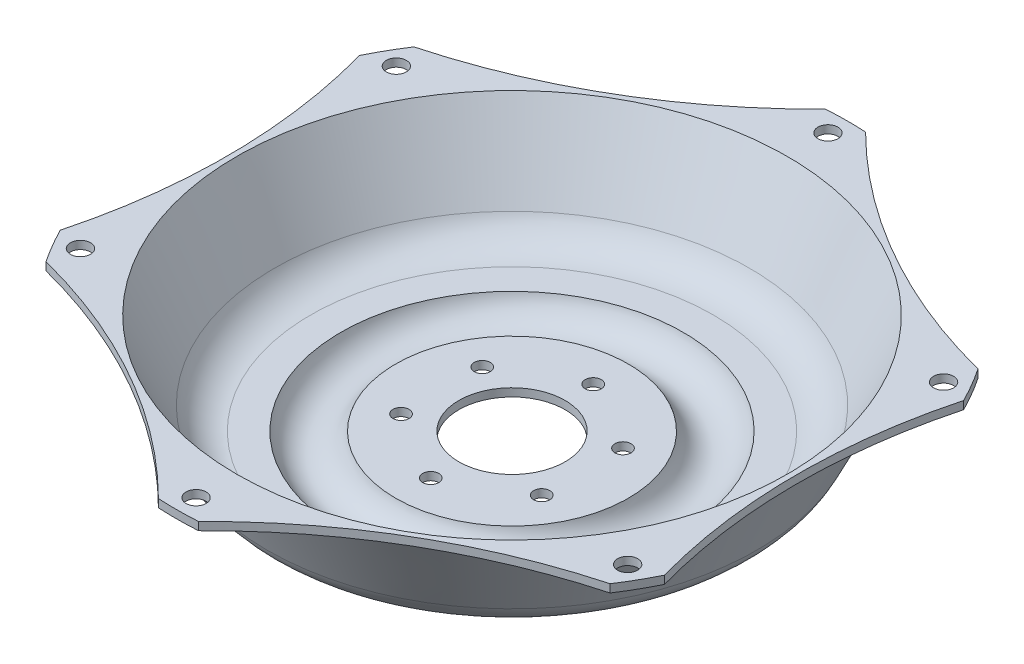
ISO-10303-21;
HEADER;
FILE_DESCRIPTION(('STEP AP214'),'2;1');
FILE_NAME('part.step','',(''),(''),'','','');
FILE_SCHEMA(('AUTOMOTIVE_DESIGN { 1 0 10303 214 1 1 1 1 }'));
ENDSEC;
DATA;
#1=APPLICATION_CONTEXT('core data for automotive mechanical design processes');
#2=APPLICATION_PROTOCOL_DEFINITION('international standard','automotive_design',2000,#1);
#3=PRODUCT_CONTEXT('',#1,'mechanical');
#4=PRODUCT('Part','Part','',(#3));
#5=PRODUCT_RELATED_PRODUCT_CATEGORY('part','',(#4));
#6=PRODUCT_DEFINITION_FORMATION('','',#4);
#7=PRODUCT_DEFINITION_CONTEXT('part definition',#1,'design');
#8=PRODUCT_DEFINITION('design','',#6,#7);
#9=PRODUCT_DEFINITION_SHAPE('','',#8);
#10=(LENGTH_UNIT() NAMED_UNIT(*) SI_UNIT(.MILLI.,.METRE.));
#11=(NAMED_UNIT(*) PLANE_ANGLE_UNIT() SI_UNIT($,.RADIAN.));
#12=(NAMED_UNIT(*) SI_UNIT($,.STERADIAN.) SOLID_ANGLE_UNIT());
#13=UNCERTAINTY_MEASURE_WITH_UNIT(LENGTH_MEASURE(1.E-05),#10,'distance_accuracy_value','');
#14=(GEOMETRIC_REPRESENTATION_CONTEXT(3) GLOBAL_UNCERTAINTY_ASSIGNED_CONTEXT((#13)) GLOBAL_UNIT_ASSIGNED_CONTEXT((#10,
#11,#12)) REPRESENTATION_CONTEXT('',''));
#15=CARTESIAN_POINT('',(0.,0.,0.));
#16=DIRECTION('',(0.,0.,1.));
#17=DIRECTION('',(1.,0.,0.));
#18=AXIS2_PLACEMENT_3D('',#15,#16,#17);
#19=CARTESIAN_POINT('',(0.,100.,0.));
#20=DIRECTION('',(0.,1.,0.));
#21=DIRECTION('',(0.,0.,1.));
#22=AXIS2_PLACEMENT_3D('',#19,#20,#21);
#23=CYLINDRICAL_SURFACE('',#22,335.);
#24=CARTESIAN_POINT('',(0.,100.,0.));
#25=DIRECTION('',(0.,1.,0.));
#26=DIRECTION('',(0.,0.,1.));
#27=AXIS2_PLACEMENT_3D('',#24,#25,#26);
#28=CIRCLE('',#27,335.);
#29=CARTESIAN_POINT('',(280.699413185461,100.,182.846491454821));
#30=VERTEX_POINT('',#29);
#31=CARTESIAN_POINT('',(300.373886854818,100.,148.32574994157));
#32=VERTEX_POINT('',#31);
#33=EDGE_CURVE('E219',#30,#32,#28,.T.);
#34=ORIENTED_EDGE('',*,*,#33,.F.);
#35=DIRECTION('',(0.,-1.,0.));
#36=VECTOR('',#35,1.);
#37=CARTESIAN_POINT('',(280.699413185461,102.,182.846491454821));
#38=LINE('',#37,#36);
#39=CARTESIAN_POINT('',(280.699413185461,92.,182.846491454821));
#40=VERTEX_POINT('',#39);
#41=EDGE_CURVE('E172',#30,#40,#38,.T.);
#42=ORIENTED_EDGE('',*,*,#41,.T.);
#43=CARTESIAN_POINT('',(0.,92.,0.));
#44=DIRECTION('',(0.,1.,0.));
#45=DIRECTION('',(0.,0.,1.));
#46=AXIS2_PLACEMENT_3D('',#43,#44,#45);
#47=CIRCLE('',#46,335.);
#48=CARTESIAN_POINT('',(300.373886854818,92.,148.32574994157));
#49=VERTEX_POINT('',#48);
#50=EDGE_CURVE('E178',#40,#49,#47,.T.);
#51=ORIENTED_EDGE('',*,*,#50,.T.);
#52=DIRECTION('',(0.,-1.,0.));
#53=VECTOR('',#52,1.);
#54=CARTESIAN_POINT('',(300.373886854818,102.,148.32574994157));
#55=LINE('',#54,#53);
#56=EDGE_CURVE('E322',#32,#49,#55,.T.);
#57=ORIENTED_EDGE('',*,*,#56,.F.);
#58=EDGE_LOOP('',(#34,#42,#51,#57));
#59=FACE_BOUND('',#58,.T.);
#60=ADVANCED_FACE('F44',(#59),#23,.T.);
#61=CARTESIAN_POINT('',(-18.0000000000001,92.,334.516068373404));
#62=VERTEX_POINT('',#61);
#63=CARTESIAN_POINT('',(21.7330759426298,92.,334.29429162053));
#64=VERTEX_POINT('',#63);
#65=EDGE_CURVE('E169',#62,#64,#47,.T.);
#66=ORIENTED_EDGE('',*,*,#65,.T.);
#67=DIRECTION('',(0.,-1.,0.));
#68=VECTOR('',#67,1.);
#69=CARTESIAN_POINT('',(21.7330759426298,102.,334.29429162053));
#70=LINE('',#69,#68);
#71=CARTESIAN_POINT('',(21.7330759426298,100.,334.29429162053));
#72=VERTEX_POINT('',#71);
#73=EDGE_CURVE('E149',#72,#64,#70,.T.);
#74=ORIENTED_EDGE('',*,*,#73,.F.);
#75=CARTESIAN_POINT('',(-18.0000000000001,100.,334.516068373404));
#76=VERTEX_POINT('',#75);
#77=EDGE_CURVE('E216',#76,#72,#28,.T.);
#78=ORIENTED_EDGE('',*,*,#77,.F.);
#79=DIRECTION('',(0.,-1.,0.));
#80=VECTOR('',#79,1.);
#81=CARTESIAN_POINT('',(-18.0000000000001,102.,334.516068373404));
#82=LINE('',#81,#80);
#83=EDGE_CURVE('E176',#76,#62,#82,.T.);
#84=ORIENTED_EDGE('',*,*,#83,.T.);
#85=EDGE_LOOP('',(#66,#74,#78,#84));
#86=FACE_BOUND('',#85,.T.);
#87=ADVANCED_FACE('F175',(#86),#23,.T.);
#88=CARTESIAN_POINT('',(298.69941318546,100.,-151.669576918584));
#89=VERTEX_POINT('',#88);
#90=CARTESIAN_POINT('',(278.640810912188,100.,-185.968541678958));
#91=VERTEX_POINT('',#90);
#92=EDGE_CURVE('E312',#89,#91,#28,.T.);
#93=ORIENTED_EDGE('',*,*,#92,.F.);
#94=DIRECTION('',(0.,-1.,0.));
#95=VECTOR('',#94,1.);
#96=CARTESIAN_POINT('',(298.69941318546,102.,-151.669576918584));
#97=LINE('',#96,#95);
#98=CARTESIAN_POINT('',(298.69941318546,92.,-151.669576918584));
#99=VERTEX_POINT('',#98);
#100=EDGE_CURVE('E335',#89,#99,#97,.T.);
#101=ORIENTED_EDGE('',*,*,#100,.T.);
#102=CARTESIAN_POINT('',(278.640810912188,92.,-185.968541678958));
#103=VERTEX_POINT('',#102);
#104=EDGE_CURVE('E184',#99,#103,#47,.T.);
#105=ORIENTED_EDGE('',*,*,#104,.T.);
#106=DIRECTION('',(0.,-1.,0.));
#107=VECTOR('',#106,1.);
#108=CARTESIAN_POINT('',(278.640810912188,102.,-185.968541678958));
#109=LINE('',#108,#107);
#110=EDGE_CURVE('E339',#91,#103,#109,.T.);
#111=ORIENTED_EDGE('',*,*,#110,.F.);
#112=EDGE_LOOP('',(#93,#101,#105,#111));
#113=FACE_BOUND('',#112,.T.);
#114=ADVANCED_FACE('F292',(#113),#23,.T.);
#115=CARTESIAN_POINT('',(18.0000000000001,100.,-334.516068373404));
#116=VERTEX_POINT('',#115);
#117=CARTESIAN_POINT('',(-21.7330759426321,100.,-334.29429162053));
#118=VERTEX_POINT('',#117);
#119=EDGE_CURVE('E308',#116,#118,#28,.T.);
#120=ORIENTED_EDGE('',*,*,#119,.F.);
#121=DIRECTION('',(0.,-1.,0.));
#122=VECTOR('',#121,1.);
#123=CARTESIAN_POINT('',(18.0000000000001,102.,-334.516068373404));
#124=LINE('',#123,#122);
#125=CARTESIAN_POINT('',(18.0000000000001,92.,-334.516068373404));
#126=VERTEX_POINT('',#125);
#127=EDGE_CURVE('E330',#116,#126,#124,.T.);
#128=ORIENTED_EDGE('',*,*,#127,.T.);
#129=CARTESIAN_POINT('',(-21.7330759426321,92.,-334.29429162053));
#130=VERTEX_POINT('',#129);
#131=EDGE_CURVE('E193',#126,#130,#47,.T.);
#132=ORIENTED_EDGE('',*,*,#131,.T.);
#133=DIRECTION('',(0.,-1.,0.));
#134=VECTOR('',#133,1.);
#135=CARTESIAN_POINT('',(-21.7330759426321,102.,-334.29429162053));
#136=LINE('',#135,#134);
#137=EDGE_CURVE('E347',#118,#130,#136,.T.);
#138=ORIENTED_EDGE('',*,*,#137,.F.);
#139=EDGE_LOOP('',(#120,#128,#132,#138));
#140=FACE_BOUND('',#139,.T.);
#141=ADVANCED_FACE('F301',(#140),#23,.T.);
#142=CARTESIAN_POINT('',(-280.699413185462,100.,-182.846491454819));
#143=VERTEX_POINT('',#142);
#144=CARTESIAN_POINT('',(-300.373886854819,100.,-148.325749941568));
#145=VERTEX_POINT('',#144);
#146=EDGE_CURVE('E306',#143,#145,#28,.T.);
#147=ORIENTED_EDGE('',*,*,#146,.F.);
#148=DIRECTION('',(0.,-1.,0.));
#149=VECTOR('',#148,1.);
#150=CARTESIAN_POINT('',(-280.699413185462,102.,-182.846491454819));
#151=LINE('',#150,#149);
#152=CARTESIAN_POINT('',(-280.699413185462,92.,-182.846491454819));
#153=VERTEX_POINT('',#152);
#154=EDGE_CURVE('E352',#143,#153,#151,.T.);
#155=ORIENTED_EDGE('',*,*,#154,.T.);
#156=CARTESIAN_POINT('',(-300.373886854819,92.,-148.325749941568));
#157=VERTEX_POINT('',#156);
#158=EDGE_CURVE('E186',#153,#157,#47,.T.);
#159=ORIENTED_EDGE('',*,*,#158,.T.);
#160=DIRECTION('',(0.,-1.,0.));
#161=VECTOR('',#160,1.);
#162=CARTESIAN_POINT('',(-300.373886854819,102.,-148.325749941568));
#163=LINE('',#162,#161);
#164=EDGE_CURVE('E356',#145,#157,#163,.T.);
#165=ORIENTED_EDGE('',*,*,#164,.F.);
#166=EDGE_LOOP('',(#147,#155,#159,#165));
#167=FACE_BOUND('',#166,.T.);
#168=ADVANCED_FACE('F295',(#167),#23,.T.);
#169=CARTESIAN_POINT('',(-298.699413185459,100.,151.669576918586));
#170=VERTEX_POINT('',#169);
#171=CARTESIAN_POINT('',(-278.640810912188,100.,185.968541678958));
#172=VERTEX_POINT('',#171);
#173=EDGE_CURVE('E220',#170,#172,#28,.T.);
#174=ORIENTED_EDGE('',*,*,#173,.F.);
#175=DIRECTION('',(0.,-1.,0.));
#176=VECTOR('',#175,1.);
#177=CARTESIAN_POINT('',(-298.699413185459,102.,151.669576918586));
#178=LINE('',#177,#176);
#179=CARTESIAN_POINT('',(-298.699413185459,92.,151.669576918586));
#180=VERTEX_POINT('',#179);
#181=EDGE_CURVE('E304',#170,#180,#178,.T.);
#182=ORIENTED_EDGE('',*,*,#181,.T.);
#183=CARTESIAN_POINT('',(-278.640810912188,92.,185.968541678958));
#184=VERTEX_POINT('',#183);
#185=EDGE_CURVE('E179',#180,#184,#47,.T.);
#186=ORIENTED_EDGE('',*,*,#185,.T.);
#187=DIRECTION('',(0.,-1.,0.));
#188=VECTOR('',#187,1.);
#189=CARTESIAN_POINT('',(-278.640810912188,102.,185.968541678958));
#190=LINE('',#189,#188);
#191=EDGE_CURVE('E212',#172,#184,#190,.T.);
#192=ORIENTED_EDGE('',*,*,#191,.F.);
#193=EDGE_LOOP('',(#174,#182,#186,#192));
#194=FACE_BOUND('',#193,.T.);
#195=ADVANCED_FACE('F288',(#194),#23,.T.);
#196=CARTESIAN_POINT('',(274.476350399319,92.,0.));
#197=DIRECTION('',(0.,1.,0.));
#198=DIRECTION('',(0.,0.,1.));
#199=AXIS2_PLACEMENT_3D('',#196,#197,#198);
#200=PLANE('',#199);
#201=CARTESIAN_POINT('',(429.181794485482,92.,733.874227341707));
#202=DIRECTION('',(0.,1.,0.));
#203=DIRECTION('',(0.86602540378444,0.,0.499999999999998));
#204=AXIS2_PLACEMENT_3D('',#201,#202,#203);
#205=CIRCLE('',#204,570.682559110713);
#206=CARTESIAN_POINT('',(141.086400584634,92.,241.248987137485));
#207=VERTEX_POINT('',#206);
#208=EDGE_CURVE('E152',#64,#207,#205,.F.);
#209=ORIENTED_EDGE('',*,*,#208,.F.);
#210=ORIENTED_EDGE('',*,*,#65,.F.);
#211=CARTESIAN_POINT('',(-420.962826817856,92.,738.619450537072));
#212=DIRECTION('',(0.,-1.,0.));
#213=DIRECTION('',(0.,0.,-1.));
#214=AXIS2_PLACEMENT_3D('',#211,#212,#213);
#215=CIRCLE('',#214,570.682559110713);
#216=CARTESIAN_POINT('',(-138.384551206011,92.,242.808900603543));
#217=VERTEX_POINT('',#216);
#218=EDGE_CURVE('E363',#62,#217,#215,.F.);
#219=ORIENTED_EDGE('',*,*,#218,.T.);
#220=CARTESIAN_POINT('',(0.,92.,0.));
#221=DIRECTION('',(0.,1.,0.));
#222=DIRECTION('',(0.,0.,1.));
#223=AXIS2_PLACEMENT_3D('',#220,#221,#222);
#224=CIRCLE('',#223,279.475305214593);
#225=EDGE_CURVE('E171',#217,#207,#224,.T.);
#226=ORIENTED_EDGE('',*,*,#225,.T.);
#227=EDGE_LOOP('',(#209,#210,#219,#226));
#228=FACE_BOUND('',#227,.T.);
#229=CARTESIAN_POINT('',(0.,92.,315.));
#230=DIRECTION('',(0.,-1.,0.));
#231=DIRECTION('',(0.,0.,-1.));
#232=AXIS2_PLACEMENT_3D('',#229,#230,#231);
#233=CIRCLE('',#232,10.);
#234=CARTESIAN_POINT('',(0.,92.,305.));
#235=VERTEX_POINT('',#234);
#236=EDGE_CURVE('E365',#235,#235,#233,.T.);
#237=ORIENTED_EDGE('',*,*,#236,.F.);
#238=EDGE_LOOP('',(#237));
#239=FACE_BOUND('',#238,.T.);
#240=ADVANCED_FACE('F166',(#228,#239),#200,.F.);
#241=CARTESIAN_POINT('',(272.798002192099,92.,157.499999999999));
#242=DIRECTION('',(0.,-1.,0.));
#243=DIRECTION('',(-0.86602540378444,0.,-0.499999999999998));
#244=AXIS2_PLACEMENT_3D('',#241,#242,#243);
#245=CIRCLE('',#244,10.);
#246=CARTESIAN_POINT('',(264.137748154254,92.,152.499999999999));
#247=VERTEX_POINT('',#246);
#248=EDGE_CURVE('E359',#247,#247,#245,.T.);
#249=ORIENTED_EDGE('',*,*,#248,.F.);
#250=EDGE_LOOP('',(#249));
#251=FACE_BOUND('',#250,.T.);
#252=EDGE_CURVE('E160',#207,#40,#205,.F.);
#253=ORIENTED_EDGE('',*,*,#252,.F.);
#254=CARTESIAN_POINT('',(279.470951790644,92.,-1.55991346605877));
#255=VERTEX_POINT('',#254);
#256=EDGE_CURVE('E194',#207,#255,#224,.T.);
#257=ORIENTED_EDGE('',*,*,#256,.T.);
#258=CARTESIAN_POINT('',(850.144621303336,92.,-4.74522319536791));
#259=DIRECTION('',(0.,1.,0.));
#260=DIRECTION('',(0.866025403784436,0.,-0.500000000000004));
#261=AXIS2_PLACEMENT_3D('',#258,#259,#260);
#262=CIRCLE('',#261,570.682559110713);
#263=EDGE_CURVE('E328',#49,#255,#262,.F.);
#264=ORIENTED_EDGE('',*,*,#263,.F.);
#265=ORIENTED_EDGE('',*,*,#50,.F.);
#266=EDGE_LOOP('',(#253,#257,#264,#265));
#267=FACE_BOUND('',#266,.T.);
#268=ADVANCED_FACE('F300',(#251,#267),#200,.F.);
#269=CARTESIAN_POINT('',(272.798002192097,92.,-157.500000000001));
#270=DIRECTION('',(0.,-1.,0.));
#271=DIRECTION('',(-0.866025403784436,0.,0.500000000000004));
#272=AXIS2_PLACEMENT_3D('',#269,#270,#271);
#273=CIRCLE('',#272,10.);
#274=CARTESIAN_POINT('',(264.137748154253,92.,-152.500000000001));
#275=VERTEX_POINT('',#274);
#276=EDGE_CURVE('E376',#275,#275,#273,.T.);
#277=ORIENTED_EDGE('',*,*,#276,.F.);
#278=EDGE_LOOP('',(#277));
#279=FACE_BOUND('',#278,.T.);
#280=EDGE_CURVE('E325',#255,#99,#262,.F.);
#281=ORIENTED_EDGE('',*,*,#280,.F.);
#282=CARTESIAN_POINT('',(138.384551206011,92.,-242.808900603543));
#283=VERTEX_POINT('',#282);
#284=EDGE_CURVE('E198',#255,#283,#224,.T.);
#285=ORIENTED_EDGE('',*,*,#284,.T.);
#286=CARTESIAN_POINT('',(420.962826817856,92.,-738.619450537072));
#287=DIRECTION('',(0.,1.,0.));
#288=DIRECTION('',(0.,0.,-1.));
#289=AXIS2_PLACEMENT_3D('',#286,#287,#288);
#290=CIRCLE('',#289,570.682559110713);
#291=EDGE_CURVE('E343',#103,#283,#290,.F.);
#292=ORIENTED_EDGE('',*,*,#291,.F.);
#293=ORIENTED_EDGE('',*,*,#104,.F.);
#294=EDGE_LOOP('',(#281,#285,#292,#293));
#295=FACE_BOUND('',#294,.T.);
#296=ADVANCED_FACE('F486',(#279,#295),#200,.F.);
#297=CARTESIAN_POINT('',(0.,92.,-315.));
#298=DIRECTION('',(0.,-1.,0.));
#299=DIRECTION('',(0.,0.,1.));
#300=AXIS2_PLACEMENT_3D('',#297,#298,#299);
#301=CIRCLE('',#300,10.);
#302=CARTESIAN_POINT('',(0.,92.,-305.));
#303=VERTEX_POINT('',#302);
#304=EDGE_CURVE('E391',#303,#303,#301,.T.);
#305=ORIENTED_EDGE('',*,*,#304,.F.);
#306=EDGE_LOOP('',(#305));
#307=FACE_BOUND('',#306,.T.);
#308=EDGE_CURVE('E341',#283,#126,#290,.F.);
#309=ORIENTED_EDGE('',*,*,#308,.F.);
#310=CARTESIAN_POINT('',(-141.086400584635,92.,-241.248987137484));
#311=VERTEX_POINT('',#310);
#312=EDGE_CURVE('E205',#283,#311,#224,.T.);
#313=ORIENTED_EDGE('',*,*,#312,.T.);
#314=CARTESIAN_POINT('',(-429.181794485487,92.,-733.874227341704));
#315=DIRECTION('',(0.,1.,0.));
#316=DIRECTION('',(-0.866025403784443,0.,-0.499999999999992));
#317=AXIS2_PLACEMENT_3D('',#314,#315,#316);
#318=CIRCLE('',#317,570.682559110713);
#319=EDGE_CURVE('E66',#130,#311,#318,.F.);
#320=ORIENTED_EDGE('',*,*,#319,.F.);
#321=ORIENTED_EDGE('',*,*,#131,.F.);
#322=EDGE_LOOP('',(#309,#313,#320,#321));
#323=FACE_BOUND('',#322,.T.);
#324=ADVANCED_FACE('F497',(#307,#323),#200,.F.);
#325=CARTESIAN_POINT('',(-272.7980021921,92.,-157.499999999997));
#326=DIRECTION('',(0.,-1.,0.));
#327=DIRECTION('',(0.866025403784443,0.,0.499999999999992));
#328=AXIS2_PLACEMENT_3D('',#325,#326,#327);
#329=CIRCLE('',#328,10.);
#330=CARTESIAN_POINT('',(-264.137748154255,92.,-152.499999999998));
#331=VERTEX_POINT('',#330);
#332=EDGE_CURVE('E385',#331,#331,#329,.T.);
#333=ORIENTED_EDGE('',*,*,#332,.F.);
#334=EDGE_LOOP('',(#333));
#335=FACE_BOUND('',#334,.T.);
#336=EDGE_CURVE('E349',#311,#153,#318,.F.);
#337=ORIENTED_EDGE('',*,*,#336,.F.);
#338=CARTESIAN_POINT('',(-279.470951790644,92.,1.55991346606071));
#339=VERTEX_POINT('',#338);
#340=EDGE_CURVE('E199',#311,#339,#224,.T.);
#341=ORIENTED_EDGE('',*,*,#340,.T.);
#342=CARTESIAN_POINT('',(-850.144621303336,92.,4.74522319537379));
#343=DIRECTION('',(0.,1.,0.));
#344=DIRECTION('',(-0.866025403784433,0.,0.50000000000001));
#345=AXIS2_PLACEMENT_3D('',#342,#343,#344);
#346=CIRCLE('',#345,570.682559110713);
#347=EDGE_CURVE('E58',#157,#339,#346,.F.);
#348=ORIENTED_EDGE('',*,*,#347,.F.);
#349=ORIENTED_EDGE('',*,*,#158,.F.);
#350=EDGE_LOOP('',(#337,#341,#348,#349));
#351=FACE_BOUND('',#350,.T.);
#352=ADVANCED_FACE('F285',(#335,#351),#200,.F.);
#353=CARTESIAN_POINT('',(274.476350399319,100.,0.));
#354=DIRECTION('',(0.,1.,0.));
#355=DIRECTION('',(0.,0.,1.));
#356=AXIS2_PLACEMENT_3D('',#353,#354,#355);
#357=PLANE('',#356);
#358=CARTESIAN_POINT('',(-272.798002192096,100.,157.500000000003));
#359=DIRECTION('',(0.,1.,0.));
#360=DIRECTION('',(-0.866025403784433,0.,0.50000000000001));
#361=AXIS2_PLACEMENT_3D('',#358,#359,#360);
#362=CIRCLE('',#361,10.);
#363=CARTESIAN_POINT('',(-281.458256229941,100.,162.500000000003));
#364=VERTEX_POINT('',#363);
#365=EDGE_CURVE('E381',#364,#364,#362,.T.);
#366=ORIENTED_EDGE('',*,*,#365,.F.);
#367=EDGE_LOOP('',(#366));
#368=FACE_BOUND('',#367,.T.);
#369=CARTESIAN_POINT('',(-272.7980021921,100.,-157.499999999997));
#370=DIRECTION('',(0.,1.,0.));
#371=DIRECTION('',(-0.866025403784443,0.,-0.499999999999992));
#372=AXIS2_PLACEMENT_3D('',#369,#370,#371);
#373=CIRCLE('',#372,10.);
#374=CARTESIAN_POINT('',(-281.458256229944,100.,-162.499999999997));
#375=VERTEX_POINT('',#374);
#376=EDGE_CURVE('E380',#375,#375,#373,.T.);
#377=ORIENTED_EDGE('',*,*,#376,.F.);
#378=EDGE_LOOP('',(#377));
#379=FACE_BOUND('',#378,.T.);
#380=CARTESIAN_POINT('',(0.,100.,-315.));
#381=DIRECTION('',(0.,1.,0.));
#382=DIRECTION('',(0.,0.,-1.));
#383=AXIS2_PLACEMENT_3D('',#380,#381,#382);
#384=CIRCLE('',#383,10.);
#385=CARTESIAN_POINT('',(0.,100.,-325.));
#386=VERTEX_POINT('',#385);
#387=EDGE_CURVE('E388',#386,#386,#384,.T.);
#388=ORIENTED_EDGE('',*,*,#387,.F.);
#389=EDGE_LOOP('',(#388));
#390=FACE_BOUND('',#389,.T.);
#391=CARTESIAN_POINT('',(272.798002192097,100.,-157.500000000001));
#392=DIRECTION('',(0.,1.,0.));
#393=DIRECTION('',(0.866025403784436,0.,-0.500000000000004));
#394=AXIS2_PLACEMENT_3D('',#391,#392,#393);
#395=CIRCLE('',#394,10.);
#396=CARTESIAN_POINT('',(281.458256229942,100.,-162.500000000001));
#397=VERTEX_POINT('',#396);
#398=EDGE_CURVE('E394',#397,#397,#395,.T.);
#399=ORIENTED_EDGE('',*,*,#398,.F.);
#400=EDGE_LOOP('',(#399));
#401=FACE_BOUND('',#400,.T.);
#402=CARTESIAN_POINT('',(272.798002192099,100.,157.499999999999));
#403=DIRECTION('',(0.,1.,0.));
#404=DIRECTION('',(0.86602540378444,0.,0.499999999999998));
#405=AXIS2_PLACEMENT_3D('',#402,#403,#404);
#406=CIRCLE('',#405,10.);
#407=CARTESIAN_POINT('',(281.458256229943,100.,162.499999999999));
#408=VERTEX_POINT('',#407);
#409=EDGE_CURVE('E373',#408,#408,#406,.T.);
#410=ORIENTED_EDGE('',*,*,#409,.F.);
#411=EDGE_LOOP('',(#410));
#412=FACE_BOUND('',#411,.T.);
#413=CARTESIAN_POINT('',(0.,100.,315.));
#414=DIRECTION('',(0.,1.,0.));
#415=DIRECTION('',(0.,0.,1.));
#416=AXIS2_PLACEMENT_3D('',#413,#414,#415);
#417=CIRCLE('',#416,10.);
#418=CARTESIAN_POINT('',(0.,100.,325.));
#419=VERTEX_POINT('',#418);
#420=EDGE_CURVE('E207',#419,#419,#417,.T.);
#421=ORIENTED_EDGE('',*,*,#420,.F.);
#422=EDGE_LOOP('',(#421));
#423=FACE_BOUND('',#422,.T.);
#424=CARTESIAN_POINT('',(0.,100.,0.));
#425=DIRECTION('',(0.,1.,0.));
#426=DIRECTION('',(0.,0.,1.));
#427=AXIS2_PLACEMENT_3D('',#424,#425,#426);
#428=CIRCLE('',#427,274.476350399319);
#429=CARTESIAN_POINT('',(0.,100.,274.476350399319));
#430=VERTEX_POINT('',#429);
#431=EDGE_CURVE('E221',#430,#430,#428,.T.);
#432=ORIENTED_EDGE('',*,*,#431,.F.);
#433=EDGE_LOOP('',(#432));
#434=FACE_BOUND('',#433,.T.);
#435=ORIENTED_EDGE('',*,*,#77,.T.);
#436=CARTESIAN_POINT('',(429.181794485482,100.,733.874227341707));
#437=DIRECTION('',(0.,1.,0.));
#438=DIRECTION('',(0.86602540378444,0.,0.499999999999998));
#439=AXIS2_PLACEMENT_3D('',#436,#437,#438);
#440=CIRCLE('',#439,570.682559110713);
#441=EDGE_CURVE('E155',#72,#30,#440,.F.);
#442=ORIENTED_EDGE('',*,*,#441,.T.);
#443=ORIENTED_EDGE('',*,*,#33,.T.);
#444=CARTESIAN_POINT('',(850.144621303336,100.,-4.74522319536791));
#445=DIRECTION('',(0.,1.,0.));
#446=DIRECTION('',(0.866025403784436,0.,-0.500000000000004));
#447=AXIS2_PLACEMENT_3D('',#444,#445,#446);
#448=CIRCLE('',#447,570.682559110713);
#449=EDGE_CURVE('E161',#32,#89,#448,.F.);
#450=ORIENTED_EDGE('',*,*,#449,.T.);
#451=ORIENTED_EDGE('',*,*,#92,.T.);
#452=CARTESIAN_POINT('',(420.962826817856,100.,-738.619450537072));
#453=DIRECTION('',(0.,1.,0.));
#454=DIRECTION('',(0.,0.,-1.));
#455=AXIS2_PLACEMENT_3D('',#452,#453,#454);
#456=CIRCLE('',#455,570.682559110713);
#457=EDGE_CURVE('E326',#91,#116,#456,.F.);
#458=ORIENTED_EDGE('',*,*,#457,.T.);
#459=ORIENTED_EDGE('',*,*,#119,.T.);
#460=CARTESIAN_POINT('',(-429.181794485487,100.,-733.874227341704));
#461=DIRECTION('',(0.,1.,0.));
#462=DIRECTION('',(-0.866025403784443,0.,-0.499999999999992));
#463=AXIS2_PLACEMENT_3D('',#460,#461,#462);
#464=CIRCLE('',#463,570.682559110713);
#465=EDGE_CURVE('E342',#118,#143,#464,.F.);
#466=ORIENTED_EDGE('',*,*,#465,.T.);
#467=ORIENTED_EDGE('',*,*,#146,.T.);
#468=CARTESIAN_POINT('',(-850.144621303336,100.,4.74522319537379));
#469=DIRECTION('',(0.,1.,0.));
#470=DIRECTION('',(-0.866025403784433,0.,0.50000000000001));
#471=AXIS2_PLACEMENT_3D('',#468,#469,#470);
#472=CIRCLE('',#471,570.682559110713);
#473=EDGE_CURVE('E350',#145,#170,#472,.F.);
#474=ORIENTED_EDGE('',*,*,#473,.T.);
#475=ORIENTED_EDGE('',*,*,#173,.T.);
#476=CARTESIAN_POINT('',(-420.962826817856,100.,738.619450537072));
#477=DIRECTION('',(0.,1.,0.));
#478=DIRECTION('',(0.,0.,1.));
#479=AXIS2_PLACEMENT_3D('',#476,#477,#478);
#480=CIRCLE('',#479,570.682559110713);
#481=EDGE_CURVE('E200',#172,#76,#480,.F.);
#482=ORIENTED_EDGE('',*,*,#481,.T.);
#483=EDGE_LOOP('',(#435,#442,#443,#450,#451,#458,#459,#466,#467,#474,#475,#482));
#484=FACE_BOUND('',#483,.T.);
#485=ADVANCED_FACE('F282',(#368,#379,#390,#401,#412,#423,#434,#484),#357,.T.);
#486=CARTESIAN_POINT('',(-272.798002192096,92.,157.500000000003));
#487=DIRECTION('',(0.,-1.,0.));
#488=DIRECTION('',(0.866025403784433,0.,-0.50000000000001));
#489=AXIS2_PLACEMENT_3D('',#486,#487,#488);
#490=CIRCLE('',#489,10.);
#491=CARTESIAN_POINT('',(-264.137748154252,92.,152.500000000003));
#492=VERTEX_POINT('',#491);
#493=EDGE_CURVE('E377',#492,#492,#490,.T.);
#494=ORIENTED_EDGE('',*,*,#493,.F.);
#495=EDGE_LOOP('',(#494));
#496=FACE_BOUND('',#495,.T.);
#497=EDGE_CURVE('E358',#339,#180,#346,.F.);
#498=ORIENTED_EDGE('',*,*,#497,.F.);
#499=EDGE_CURVE('E196',#339,#217,#224,.T.);
#500=ORIENTED_EDGE('',*,*,#499,.T.);
#501=CARTESIAN_POINT('',(-420.962826817856,92.,738.619450537072));
#502=DIRECTION('',(0.,1.,0.));
#503=DIRECTION('',(0.,0.,1.));
#504=AXIS2_PLACEMENT_3D('',#501,#502,#503);
#505=CIRCLE('',#504,570.682559110713);
#506=EDGE_CURVE('E12',#184,#217,#505,.F.);
#507=ORIENTED_EDGE('',*,*,#506,.F.);
#508=ORIENTED_EDGE('',*,*,#185,.F.);
#509=EDGE_LOOP('',(#498,#500,#507,#508));
#510=FACE_BOUND('',#509,.T.);
#511=ADVANCED_FACE('F273',(#496,#510),#200,.F.);
#512=CARTESIAN_POINT('',(0.,0.,0.));
#513=DIRECTION('',(0.,1.,0.));
#514=DIRECTION('',(0.,0.,1.));
#515=AXIS2_PLACEMENT_3D('',#512,#513,#514);
#516=CYLINDRICAL_SURFACE('',#515,53.);
#517=CARTESIAN_POINT('',(0.,0.,0.));
#518=DIRECTION('',(0.,1.,0.));
#519=DIRECTION('',(0.,0.,1.));
#520=AXIS2_PLACEMENT_3D('',#517,#518,#519);
#521=CIRCLE('',#520,53.);
#522=CARTESIAN_POINT('',(0.,0.,53.));
#523=VERTEX_POINT('',#522);
#524=EDGE_CURVE('E51',#523,#523,#521,.T.);
#525=ORIENTED_EDGE('',*,*,#524,.T.);
#526=EDGE_LOOP('',(#525));
#527=FACE_BOUND('',#526,.T.);
#528=CARTESIAN_POINT('',(0.,-8.,0.));
#529=DIRECTION('',(0.,1.,0.));
#530=DIRECTION('',(0.,0.,1.));
#531=AXIS2_PLACEMENT_3D('',#528,#529,#530);
#532=CIRCLE('',#531,53.);
#533=CARTESIAN_POINT('',(0.,-8.,53.));
#534=VERTEX_POINT('',#533);
#535=EDGE_CURVE('E224',#534,#534,#532,.T.);
#536=ORIENTED_EDGE('',*,*,#535,.F.);
#537=EDGE_LOOP('',(#536));
#538=FACE_BOUND('',#537,.T.);
#539=ADVANCED_FACE('F270',(#527,#538),#516,.F.);
#540=CARTESIAN_POINT('',(53.,0.,0.));
#541=DIRECTION('',(0.,1.,0.));
#542=DIRECTION('',(0.,0.,1.));
#543=AXIS2_PLACEMENT_3D('',#540,#541,#542);
#544=PLANE('',#543);
#545=CARTESIAN_POINT('',(-70.1480577065391,0.,40.5000000000008));
#546=DIRECTION('',(0.,1.,0.));
#547=DIRECTION('',(-0.866025403784433,0.,0.50000000000001));
#548=AXIS2_PLACEMENT_3D('',#545,#546,#547);
#549=CIRCLE('',#548,8.);
#550=CARTESIAN_POINT('',(-77.0762609368145,0.,44.5000000000009));
#551=VERTEX_POINT('',#550);
#552=EDGE_CURVE('E417',#551,#551,#549,.T.);
#553=ORIENTED_EDGE('',*,*,#552,.F.);
#554=EDGE_LOOP('',(#553));
#555=FACE_BOUND('',#554,.T.);
#556=CARTESIAN_POINT('',(-70.1480577065399,0.,-40.4999999999993));
#557=DIRECTION('',(0.,1.,0.));
#558=DIRECTION('',(-0.866025403784443,0.,-0.499999999999992));
#559=AXIS2_PLACEMENT_3D('',#556,#557,#558);
#560=CIRCLE('',#559,8.);
#561=CARTESIAN_POINT('',(-77.0762609368155,0.,-44.4999999999993));
#562=VERTEX_POINT('',#561);
#563=EDGE_CURVE('E416',#562,#562,#560,.T.);
#564=ORIENTED_EDGE('',*,*,#563,.F.);
#565=EDGE_LOOP('',(#564));
#566=FACE_BOUND('',#565,.T.);
#567=CARTESIAN_POINT('',(0.,0.,-81.));
#568=DIRECTION('',(0.,1.,0.));
#569=DIRECTION('',(0.,0.,-1.));
#570=AXIS2_PLACEMENT_3D('',#567,#568,#569);
#571=CIRCLE('',#570,8.);
#572=CARTESIAN_POINT('',(0.,0.,-89.));
#573=VERTEX_POINT('',#572);
#574=EDGE_CURVE('E423',#573,#573,#571,.T.);
#575=ORIENTED_EDGE('',*,*,#574,.F.);
#576=EDGE_LOOP('',(#575));
#577=FACE_BOUND('',#576,.T.);
#578=CARTESIAN_POINT('',(70.1480577065393,0.,-40.5000000000003));
#579=DIRECTION('',(0.,1.,0.));
#580=DIRECTION('',(0.866025403784436,0.,-0.500000000000004));
#581=AXIS2_PLACEMENT_3D('',#578,#579,#580);
#582=CIRCLE('',#581,8.);
#583=CARTESIAN_POINT('',(77.0762609368149,0.,-44.5000000000004));
#584=VERTEX_POINT('',#583);
#585=EDGE_CURVE('E429',#584,#584,#582,.T.);
#586=ORIENTED_EDGE('',*,*,#585,.F.);
#587=EDGE_LOOP('',(#586));
#588=FACE_BOUND('',#587,.T.);
#589=CARTESIAN_POINT('',(70.1480577065396,0.,40.4999999999998));
#590=DIRECTION('',(0.,1.,0.));
#591=DIRECTION('',(0.86602540378444,0.,0.499999999999998));
#592=AXIS2_PLACEMENT_3D('',#589,#590,#591);
#593=CIRCLE('',#592,8.);
#594=CARTESIAN_POINT('',(77.0762609368152,0.,44.4999999999998));
#595=VERTEX_POINT('',#594);
#596=EDGE_CURVE('E409',#595,#595,#593,.T.);
#597=ORIENTED_EDGE('',*,*,#596,.F.);
#598=EDGE_LOOP('',(#597));
#599=FACE_BOUND('',#598,.T.);
#600=CARTESIAN_POINT('',(0.,0.,81.));
#601=DIRECTION('',(0.,1.,0.));
#602=DIRECTION('',(0.,0.,1.));
#603=AXIS2_PLACEMENT_3D('',#600,#601,#602);
#604=CIRCLE('',#603,8.);
#605=CARTESIAN_POINT('',(0.,0.,89.));
#606=VERTEX_POINT('',#605);
#607=EDGE_CURVE('E384',#606,#606,#604,.T.);
#608=ORIENTED_EDGE('',*,*,#607,.F.);
#609=EDGE_LOOP('',(#608));
#610=FACE_BOUND('',#609,.T.);
#611=CARTESIAN_POINT('',(0.,0.,0.));
#612=DIRECTION('',(0.,1.,0.));
#613=DIRECTION('',(0.,0.,1.));
#614=AXIS2_PLACEMENT_3D('',#611,#612,#613);
#615=CIRCLE('',#614,116.);
#616=CARTESIAN_POINT('',(0.,0.,116.));
#617=VERTEX_POINT('',#616);
#618=EDGE_CURVE('E233',#617,#617,#615,.T.);
#619=ORIENTED_EDGE('',*,*,#618,.T.);
#620=EDGE_LOOP('',(#619));
#621=FACE_BOUND('',#620,.T.);
#622=ORIENTED_EDGE('',*,*,#524,.F.);
#623=EDGE_LOOP('',(#622));
#624=FACE_BOUND('',#623,.T.);
#625=ADVANCED_FACE('F272',(#555,#566,#577,#588,#599,#610,#621,#624),#544,.T.);
#626=CARTESIAN_POINT('',(0.,8.,0.));
#627=DIRECTION('',(0.,1.,0.));
#628=DIRECTION('',(0.,0.,1.));
#629=AXIS2_PLACEMENT_3D('',#626,#627,#628);
#630=TOROIDAL_SURFACE('',#629,143.35415873318,28.5);
#631=CARTESIAN_POINT('',(0.,0.,0.));
#632=DIRECTION('',(0.,1.,0.));
#633=DIRECTION('',(0.,0.,1.));
#634=AXIS2_PLACEMENT_3D('',#631,#632,#633);
#635=CIRCLE('',#634,170.70831746636);
#636=CARTESIAN_POINT('',(0.,0.,170.70831746636));
#637=VERTEX_POINT('',#636);
#638=EDGE_CURVE('E230',#637,#637,#635,.T.);
#639=ORIENTED_EDGE('',*,*,#638,.T.);
#640=EDGE_LOOP('',(#639));
#641=FACE_BOUND('',#640,.T.);
#642=ORIENTED_EDGE('',*,*,#618,.F.);
#643=EDGE_LOOP('',(#642));
#644=FACE_BOUND('',#643,.T.);
#645=ADVANCED_FACE('F279',(#641,#644),#630,.F.);
#646=CARTESIAN_POINT('',(170.70831746636,0.,0.));
#647=DIRECTION('',(0.,1.,0.));
#648=DIRECTION('',(0.,0.,1.));
#649=AXIS2_PLACEMENT_3D('',#646,#647,#648);
#650=PLANE('',#649);
#651=CARTESIAN_POINT('',(0.,0.,0.));
#652=DIRECTION('',(0.,1.,0.));
#653=DIRECTION('',(0.,0.,1.));
#654=AXIS2_PLACEMENT_3D('',#651,#652,#653);
#655=CIRCLE('',#654,200.70831746636);
#656=CARTESIAN_POINT('',(0.,0.,200.70831746636));
#657=VERTEX_POINT('',#656);
#658=EDGE_CURVE('E227',#657,#657,#655,.T.);
#659=ORIENTED_EDGE('',*,*,#658,.T.);
#660=EDGE_LOOP('',(#659));
#661=FACE_BOUND('',#660,.T.);
#662=ORIENTED_EDGE('',*,*,#638,.F.);
#663=EDGE_LOOP('',(#662));
#664=FACE_BOUND('',#663,.T.);
#665=ADVANCED_FACE('F450',(#661,#664),#650,.T.);
#666=CARTESIAN_POINT('',(0.,40.,0.));
#667=DIRECTION('',(0.,1.,0.));
#668=DIRECTION('',(0.,0.,1.));
#669=AXIS2_PLACEMENT_3D('',#666,#667,#668);
#670=TOROIDAL_SURFACE('',#669,200.70831746636,40.);
#671=CARTESIAN_POINT('',(0.,22.465154128437,0.));
#672=DIRECTION('',(0.,1.,0.));
#673=DIRECTION('',(0.,0.,1.));
#674=AXIS2_PLACEMENT_3D('',#671,#672,#673);
#675=CIRCLE('',#674,236.660079318326);
#676=CARTESIAN_POINT('',(0.,22.465154128437,236.660079318326));
#677=VERTEX_POINT('',#676);
#678=EDGE_CURVE('E218',#677,#677,#675,.T.);
#679=ORIENTED_EDGE('',*,*,#678,.T.);
#680=EDGE_LOOP('',(#679));
#681=FACE_BOUND('',#680,.T.);
#682=ORIENTED_EDGE('',*,*,#658,.F.);
#683=EDGE_LOOP('',(#682));
#684=FACE_BOUND('',#683,.T.);
#685=ADVANCED_FACE('F456',(#681,#684),#670,.F.);
#686=CARTESIAN_POINT('',(0.,22.465154128437,0.));
#687=DIRECTION('',(0.,1.,0.));
#688=DIRECTION('',(0.,0.,1.));
#689=AXIS2_PLACEMENT_3D('',#686,#687,#688);
#690=CONICAL_SURFACE('',#689,236.660079318326,0.453785605518523);
#691=ORIENTED_EDGE('',*,*,#431,.T.);
#692=EDGE_LOOP('',(#691));
#693=FACE_BOUND('',#692,.T.);
#694=ORIENTED_EDGE('',*,*,#678,.F.);
#695=EDGE_LOOP('',(#694));
#696=FACE_BOUND('',#695,.T.);
#697=ADVANCED_FACE('F264',(#693,#696),#690,.F.);
#698=CARTESIAN_POINT('',(53.,-8.,0.));
#699=DIRECTION('',(0.,1.,0.));
#700=DIRECTION('',(0.,0.,1.));
#701=AXIS2_PLACEMENT_3D('',#698,#699,#700);
#702=PLANE('',#701);
#703=CARTESIAN_POINT('',(-70.1480577065391,-8.,40.5000000000008));
#704=DIRECTION('',(0.,-1.,0.));
#705=DIRECTION('',(0.866025403784433,0.,-0.50000000000001));
#706=AXIS2_PLACEMENT_3D('',#703,#704,#705);
#707=CIRCLE('',#706,8.);
#708=CARTESIAN_POINT('',(-63.2198544762636,-8.,36.5000000000007));
#709=VERTEX_POINT('',#708);
#710=EDGE_CURVE('E413',#709,#709,#707,.T.);
#711=ORIENTED_EDGE('',*,*,#710,.F.);
#712=EDGE_LOOP('',(#711));
#713=FACE_BOUND('',#712,.T.);
#714=CARTESIAN_POINT('',(-70.1480577065399,-8.,-40.4999999999993));
#715=DIRECTION('',(0.,-1.,0.));
#716=DIRECTION('',(0.866025403784443,0.,0.499999999999992));
#717=AXIS2_PLACEMENT_3D('',#714,#715,#716);
#718=CIRCLE('',#717,8.);
#719=CARTESIAN_POINT('',(-63.2198544762644,-8.,-36.4999999999994));
#720=VERTEX_POINT('',#719);
#721=EDGE_CURVE('E420',#720,#720,#718,.T.);
#722=ORIENTED_EDGE('',*,*,#721,.F.);
#723=EDGE_LOOP('',(#722));
#724=FACE_BOUND('',#723,.T.);
#725=CARTESIAN_POINT('',(0.,-8.,-81.));
#726=DIRECTION('',(0.,-1.,0.));
#727=DIRECTION('',(0.,0.,1.));
#728=AXIS2_PLACEMENT_3D('',#725,#726,#727);
#729=CIRCLE('',#728,8.);
#730=CARTESIAN_POINT('',(0.,-8.,-73.));
#731=VERTEX_POINT('',#730);
#732=EDGE_CURVE('E426',#731,#731,#729,.T.);
#733=ORIENTED_EDGE('',*,*,#732,.F.);
#734=EDGE_LOOP('',(#733));
#735=FACE_BOUND('',#734,.T.);
#736=CARTESIAN_POINT('',(70.1480577065393,-8.,-40.5000000000003));
#737=DIRECTION('',(0.,-1.,0.));
#738=DIRECTION('',(-0.866025403784436,0.,0.500000000000004));
#739=AXIS2_PLACEMENT_3D('',#736,#737,#738);
#740=CIRCLE('',#739,8.);
#741=CARTESIAN_POINT('',(63.2198544762639,-8.,-36.5000000000003));
#742=VERTEX_POINT('',#741);
#743=EDGE_CURVE('E412',#742,#742,#740,.T.);
#744=ORIENTED_EDGE('',*,*,#743,.F.);
#745=EDGE_LOOP('',(#744));
#746=FACE_BOUND('',#745,.T.);
#747=CARTESIAN_POINT('',(70.1480577065396,-8.,40.4999999999998));
#748=DIRECTION('',(0.,-1.,0.));
#749=DIRECTION('',(-0.86602540378444,0.,-0.499999999999998));
#750=AXIS2_PLACEMENT_3D('',#747,#748,#749);
#751=CIRCLE('',#750,8.);
#752=CARTESIAN_POINT('',(63.2198544762641,-8.,36.4999999999999));
#753=VERTEX_POINT('',#752);
#754=EDGE_CURVE('E406',#753,#753,#751,.T.);
#755=ORIENTED_EDGE('',*,*,#754,.F.);
#756=EDGE_LOOP('',(#755));
#757=FACE_BOUND('',#756,.T.);
#758=CARTESIAN_POINT('',(0.,-8.,81.));
#759=DIRECTION('',(0.,-1.,0.));
#760=DIRECTION('',(0.,0.,-1.));
#761=AXIS2_PLACEMENT_3D('',#758,#759,#760);
#762=CIRCLE('',#761,8.);
#763=CARTESIAN_POINT('',(0.,-8.,73.));
#764=VERTEX_POINT('',#763);
#765=EDGE_CURVE('E403',#764,#764,#762,.T.);
#766=ORIENTED_EDGE('',*,*,#765,.F.);
#767=EDGE_LOOP('',(#766));
#768=FACE_BOUND('',#767,.T.);
#769=CARTESIAN_POINT('',(0.,-8.,0.));
#770=DIRECTION('',(0.,-1.,0.));
#771=DIRECTION('',(0.,0.,-1.));
#772=AXIS2_PLACEMENT_3D('',#769,#770,#771);
#773=CIRCLE('',#772,110.547909328531);
#774=CARTESIAN_POINT('',(0.,-8.,-110.547909328531));
#775=VERTEX_POINT('',#774);
#776=EDGE_CURVE('E238',#775,#775,#773,.F.);
#777=ORIENTED_EDGE('',*,*,#776,.F.);
#778=EDGE_LOOP('',(#777));
#779=FACE_BOUND('',#778,.T.);
#780=ORIENTED_EDGE('',*,*,#535,.T.);
#781=EDGE_LOOP('',(#780));
#782=FACE_BOUND('',#781,.T.);
#783=ADVANCED_FACE('F258',(#713,#724,#735,#746,#757,#768,#779,#782),#702,.F.);
#784=CARTESIAN_POINT('',(0.,8.,0.));
#785=DIRECTION('',(0.,1.,0.));
#786=DIRECTION('',(0.,0.,1.));
#787=AXIS2_PLACEMENT_3D('',#784,#785,#786);
#788=TOROIDAL_SURFACE('',#787,143.35415873318,36.5);
#789=CARTESIAN_POINT('',(0.,-8.,0.));
#790=DIRECTION('',(0.,1.,0.));
#791=DIRECTION('',(0.,0.,1.));
#792=AXIS2_PLACEMENT_3D('',#789,#790,#791);
#793=CIRCLE('',#792,176.160408137828);
#794=CARTESIAN_POINT('',(0.,-8.,176.160408137828));
#795=VERTEX_POINT('',#794);
#796=EDGE_CURVE('E241',#795,#795,#793,.T.);
#797=ORIENTED_EDGE('',*,*,#796,.F.);
#798=EDGE_LOOP('',(#797));
#799=FACE_BOUND('',#798,.T.);
#800=ORIENTED_EDGE('',*,*,#776,.T.);
#801=EDGE_LOOP('',(#800));
#802=FACE_BOUND('',#801,.T.);
#803=ADVANCED_FACE('F252',(#799,#802),#788,.T.);
#804=CARTESIAN_POINT('',(170.70831746636,-8.,0.));
#805=DIRECTION('',(0.,1.,0.));
#806=DIRECTION('',(0.,0.,1.));
#807=AXIS2_PLACEMENT_3D('',#804,#805,#806);
#808=PLANE('',#807);
#809=CARTESIAN_POINT('',(0.,-8.00000000000001,0.));
#810=DIRECTION('',(0.,1.,0.));
#811=DIRECTION('',(0.,0.,1.));
#812=AXIS2_PLACEMENT_3D('',#809,#810,#811);
#813=CIRCLE('',#812,200.70831746636);
#814=CARTESIAN_POINT('',(0.,-8.00000000000001,200.70831746636));
#815=VERTEX_POINT('',#814);
#816=EDGE_CURVE('E181',#815,#815,#813,.T.);
#817=ORIENTED_EDGE('',*,*,#816,.F.);
#818=EDGE_LOOP('',(#817));
#819=FACE_BOUND('',#818,.T.);
#820=ORIENTED_EDGE('',*,*,#796,.T.);
#821=EDGE_LOOP('',(#820));
#822=FACE_BOUND('',#821,.T.);
#823=ADVANCED_FACE('F249',(#819,#822),#808,.F.);
#824=CARTESIAN_POINT('',(0.,40.,0.));
#825=DIRECTION('',(0.,1.,0.));
#826=DIRECTION('',(0.,0.,1.));
#827=AXIS2_PLACEMENT_3D('',#824,#825,#826);
#828=TOROIDAL_SURFACE('',#827,200.70831746636,48.);
#829=CARTESIAN_POINT('',(0.,18.9581849541244,0.));
#830=DIRECTION('',(0.,1.,0.));
#831=DIRECTION('',(0.,0.,1.));
#832=AXIS2_PLACEMENT_3D('',#829,#830,#831);
#833=CIRCLE('',#832,243.85043168872);
#834=CARTESIAN_POINT('',(0.,18.9581849541244,243.85043168872));
#835=VERTEX_POINT('',#834);
#836=EDGE_CURVE('E177',#835,#835,#833,.T.);
#837=ORIENTED_EDGE('',*,*,#836,.F.);
#838=EDGE_LOOP('',(#837));
#839=FACE_BOUND('',#838,.T.);
#840=ORIENTED_EDGE('',*,*,#816,.T.);
#841=EDGE_LOOP('',(#840));
#842=FACE_BOUND('',#841,.T.);
#843=ADVANCED_FACE('F247',(#839,#842),#828,.T.);
#844=CARTESIAN_POINT('',(0.,18.9581849541244,0.));
#845=DIRECTION('',(0.,1.,0.));
#846=DIRECTION('',(0.,0.,1.));
#847=AXIS2_PLACEMENT_3D('',#844,#845,#846);
#848=CONICAL_SURFACE('',#847,243.85043168872,0.453785605518523);
#849=ORIENTED_EDGE('',*,*,#225,.F.);
#850=ORIENTED_EDGE('',*,*,#499,.F.);
#851=ORIENTED_EDGE('',*,*,#340,.F.);
#852=ORIENTED_EDGE('',*,*,#312,.F.);
#853=ORIENTED_EDGE('',*,*,#284,.F.);
#854=ORIENTED_EDGE('',*,*,#256,.F.);
#855=EDGE_LOOP('',(#849,#850,#851,#852,#853,#854));
#856=FACE_BOUND('',#855,.T.);
#857=ORIENTED_EDGE('',*,*,#836,.T.);
#858=EDGE_LOOP('',(#857));
#859=FACE_BOUND('',#858,.T.);
#860=ADVANCED_FACE('F463',(#856,#859),#848,.T.);
#861=CARTESIAN_POINT('',(0.,102.,315.));
#862=DIRECTION('',(0.,-1.,0.));
#863=DIRECTION('',(0.,0.,-1.));
#864=AXIS2_PLACEMENT_3D('',#861,#862,#863);
#865=CYLINDRICAL_SURFACE('',#864,10.);
#866=ORIENTED_EDGE('',*,*,#420,.T.);
#867=EDGE_LOOP('',(#866));
#868=FACE_BOUND('',#867,.T.);
#869=ORIENTED_EDGE('',*,*,#236,.T.);
#870=EDGE_LOOP('',(#869));
#871=FACE_BOUND('',#870,.T.);
#872=ADVANCED_FACE('F466',(#868,#871),#865,.F.);
#873=CARTESIAN_POINT('',(-420.962826817856,102.,738.619450537072));
#874=DIRECTION('',(0.,-1.,0.));
#875=DIRECTION('',(0.,0.,-1.));
#876=AXIS2_PLACEMENT_3D('',#873,#874,#875);
#877=CYLINDRICAL_SURFACE('',#876,570.682559110713);
#878=ORIENTED_EDGE('',*,*,#191,.T.);
#879=ORIENTED_EDGE('',*,*,#506,.T.);
#880=ORIENTED_EDGE('',*,*,#218,.F.);
#881=ORIENTED_EDGE('',*,*,#83,.F.);
#882=ORIENTED_EDGE('',*,*,#481,.F.);
#883=EDGE_LOOP('',(#878,#879,#880,#881,#882));
#884=FACE_BOUND('',#883,.T.);
#885=ADVANCED_FACE('F471',(#884),#877,.F.);
#886=CARTESIAN_POINT('',(-850.144621303336,102.,4.74522319537379));
#887=DIRECTION('',(0.,-1.,0.));
#888=DIRECTION('',(0.866025403784433,0.,-0.50000000000001));
#889=AXIS2_PLACEMENT_3D('',#886,#887,#888);
#890=CYLINDRICAL_SURFACE('',#889,570.682559110713);
#891=ORIENTED_EDGE('',*,*,#164,.T.);
#892=ORIENTED_EDGE('',*,*,#347,.T.);
#893=ORIENTED_EDGE('',*,*,#497,.T.);
#894=ORIENTED_EDGE('',*,*,#181,.F.);
#895=ORIENTED_EDGE('',*,*,#473,.F.);
#896=EDGE_LOOP('',(#891,#892,#893,#894,#895));
#897=FACE_BOUND('',#896,.T.);
#898=ADVANCED_FACE('F503',(#897),#890,.F.);
#899=CARTESIAN_POINT('',(-429.181794485487,102.,-733.874227341704));
#900=DIRECTION('',(0.,-1.,0.));
#901=DIRECTION('',(0.866025403784443,0.,0.499999999999992));
#902=AXIS2_PLACEMENT_3D('',#899,#900,#901);
#903=CYLINDRICAL_SURFACE('',#902,570.682559110713);
#904=ORIENTED_EDGE('',*,*,#137,.T.);
#905=ORIENTED_EDGE('',*,*,#319,.T.);
#906=ORIENTED_EDGE('',*,*,#336,.T.);
#907=ORIENTED_EDGE('',*,*,#154,.F.);
#908=ORIENTED_EDGE('',*,*,#465,.F.);
#909=EDGE_LOOP('',(#904,#905,#906,#907,#908));
#910=FACE_BOUND('',#909,.T.);
#911=ADVANCED_FACE('F501',(#910),#903,.F.);
#912=CARTESIAN_POINT('',(420.962826817856,102.,-738.619450537072));
#913=DIRECTION('',(0.,-1.,0.));
#914=DIRECTION('',(0.,0.,1.));
#915=AXIS2_PLACEMENT_3D('',#912,#913,#914);
#916=CYLINDRICAL_SURFACE('',#915,570.682559110713);
#917=ORIENTED_EDGE('',*,*,#110,.T.);
#918=ORIENTED_EDGE('',*,*,#291,.T.);
#919=ORIENTED_EDGE('',*,*,#308,.T.);
#920=ORIENTED_EDGE('',*,*,#127,.F.);
#921=ORIENTED_EDGE('',*,*,#457,.F.);
#922=EDGE_LOOP('',(#917,#918,#919,#920,#921));
#923=FACE_BOUND('',#922,.T.);
#924=ADVANCED_FACE('F666',(#923),#916,.F.);
#925=CARTESIAN_POINT('',(850.144621303336,102.,-4.74522319536791));
#926=DIRECTION('',(0.,-1.,0.));
#927=DIRECTION('',(-0.866025403784436,0.,0.500000000000004));
#928=AXIS2_PLACEMENT_3D('',#925,#926,#927);
#929=CYLINDRICAL_SURFACE('',#928,570.682559110713);
#930=ORIENTED_EDGE('',*,*,#56,.T.);
#931=ORIENTED_EDGE('',*,*,#263,.T.);
#932=ORIENTED_EDGE('',*,*,#280,.T.);
#933=ORIENTED_EDGE('',*,*,#100,.F.);
#934=ORIENTED_EDGE('',*,*,#449,.F.);
#935=EDGE_LOOP('',(#930,#931,#932,#933,#934));
#936=FACE_BOUND('',#935,.T.);
#937=ADVANCED_FACE('F483',(#936),#929,.F.);
#938=CARTESIAN_POINT('',(429.181794485482,102.,733.874227341707));
#939=DIRECTION('',(0.,-1.,0.));
#940=DIRECTION('',(-0.86602540378444,0.,-0.499999999999998));
#941=AXIS2_PLACEMENT_3D('',#938,#939,#940);
#942=CYLINDRICAL_SURFACE('',#941,570.682559110713);
#943=ORIENTED_EDGE('',*,*,#73,.T.);
#944=ORIENTED_EDGE('',*,*,#208,.T.);
#945=ORIENTED_EDGE('',*,*,#252,.T.);
#946=ORIENTED_EDGE('',*,*,#41,.F.);
#947=ORIENTED_EDGE('',*,*,#441,.F.);
#948=EDGE_LOOP('',(#943,#944,#945,#946,#947));
#949=FACE_BOUND('',#948,.T.);
#950=ADVANCED_FACE('F151',(#949),#942,.F.);
#951=CARTESIAN_POINT('',(-272.798002192096,102.,157.500000000003));
#952=DIRECTION('',(0.,-1.,0.));
#953=DIRECTION('',(0.866025403784433,0.,-0.50000000000001));
#954=AXIS2_PLACEMENT_3D('',#951,#952,#953);
#955=CYLINDRICAL_SURFACE('',#954,10.);
#956=ORIENTED_EDGE('',*,*,#365,.T.);
#957=EDGE_LOOP('',(#956));
#958=FACE_BOUND('',#957,.T.);
#959=ORIENTED_EDGE('',*,*,#493,.T.);
#960=EDGE_LOOP('',(#959));
#961=FACE_BOUND('',#960,.T.);
#962=ADVANCED_FACE('F691',(#958,#961),#955,.F.);
#963=CARTESIAN_POINT('',(272.798002192099,102.,157.499999999999));
#964=DIRECTION('',(0.,-1.,0.));
#965=DIRECTION('',(-0.86602540378444,0.,-0.499999999999998));
#966=AXIS2_PLACEMENT_3D('',#963,#964,#965);
#967=CYLINDRICAL_SURFACE('',#966,10.);
#968=ORIENTED_EDGE('',*,*,#409,.T.);
#969=EDGE_LOOP('',(#968));
#970=FACE_BOUND('',#969,.T.);
#971=ORIENTED_EDGE('',*,*,#248,.T.);
#972=EDGE_LOOP('',(#971));
#973=FACE_BOUND('',#972,.T.);
#974=ADVANCED_FACE('F700',(#970,#973),#967,.F.);
#975=CARTESIAN_POINT('',(272.798002192097,102.,-157.500000000001));
#976=DIRECTION('',(0.,-1.,0.));
#977=DIRECTION('',(-0.866025403784436,0.,0.500000000000004));
#978=AXIS2_PLACEMENT_3D('',#975,#976,#977);
#979=CYLINDRICAL_SURFACE('',#978,10.);
#980=ORIENTED_EDGE('',*,*,#398,.T.);
#981=EDGE_LOOP('',(#980));
#982=FACE_BOUND('',#981,.T.);
#983=ORIENTED_EDGE('',*,*,#276,.T.);
#984=EDGE_LOOP('',(#983));
#985=FACE_BOUND('',#984,.T.);
#986=ADVANCED_FACE('F710',(#982,#985),#979,.F.);
#987=CARTESIAN_POINT('',(0.,102.,-315.));
#988=DIRECTION('',(0.,-1.,0.));
#989=DIRECTION('',(0.,0.,1.));
#990=AXIS2_PLACEMENT_3D('',#987,#988,#989);
#991=CYLINDRICAL_SURFACE('',#990,10.);
#992=ORIENTED_EDGE('',*,*,#387,.T.);
#993=EDGE_LOOP('',(#992));
#994=FACE_BOUND('',#993,.T.);
#995=ORIENTED_EDGE('',*,*,#304,.T.);
#996=EDGE_LOOP('',(#995));
#997=FACE_BOUND('',#996,.T.);
#998=ADVANCED_FACE('F720',(#994,#997),#991,.F.);
#999=CARTESIAN_POINT('',(-272.7980021921,102.,-157.499999999997));
#1000=DIRECTION('',(0.,-1.,0.));
#1001=DIRECTION('',(0.866025403784443,0.,0.499999999999992));
#1002=AXIS2_PLACEMENT_3D('',#999,#1000,#1001);
#1003=CYLINDRICAL_SURFACE('',#1002,10.);
#1004=ORIENTED_EDGE('',*,*,#376,.T.);
#1005=EDGE_LOOP('',(#1004));
#1006=FACE_BOUND('',#1005,.T.);
#1007=ORIENTED_EDGE('',*,*,#332,.T.);
#1008=EDGE_LOOP('',(#1007));
#1009=FACE_BOUND('',#1008,.T.);
#1010=ADVANCED_FACE('F730',(#1006,#1009),#1003,.F.);
#1011=CARTESIAN_POINT('',(0.,2.,81.));
#1012=DIRECTION('',(0.,-1.,0.));
#1013=DIRECTION('',(0.,0.,-1.));
#1014=AXIS2_PLACEMENT_3D('',#1011,#1012,#1013);
#1015=CYLINDRICAL_SURFACE('',#1014,8.);
#1016=ORIENTED_EDGE('',*,*,#607,.T.);
#1017=EDGE_LOOP('',(#1016));
#1018=FACE_BOUND('',#1017,.T.);
#1019=ORIENTED_EDGE('',*,*,#765,.T.);
#1020=EDGE_LOOP('',(#1019));
#1021=FACE_BOUND('',#1020,.T.);
#1022=ADVANCED_FACE('F740',(#1018,#1021),#1015,.F.);
#1023=CARTESIAN_POINT('',(70.1480577065396,2.,40.4999999999998));
#1024=DIRECTION('',(0.,-1.,0.));
#1025=DIRECTION('',(-0.86602540378444,0.,-0.499999999999998));
#1026=AXIS2_PLACEMENT_3D('',#1023,#1024,#1025);
#1027=CYLINDRICAL_SURFACE('',#1026,8.);
#1028=ORIENTED_EDGE('',*,*,#596,.T.);
#1029=EDGE_LOOP('',(#1028));
#1030=FACE_BOUND('',#1029,.T.);
#1031=ORIENTED_EDGE('',*,*,#754,.T.);
#1032=EDGE_LOOP('',(#1031));
#1033=FACE_BOUND('',#1032,.T.);
#1034=ADVANCED_FACE('F750',(#1030,#1033),#1027,.F.);
#1035=CARTESIAN_POINT('',(70.1480577065393,2.,-40.5000000000003));
#1036=DIRECTION('',(0.,-1.,0.));
#1037=DIRECTION('',(-0.866025403784436,0.,0.500000000000004));
#1038=AXIS2_PLACEMENT_3D('',#1035,#1036,#1037);
#1039=CYLINDRICAL_SURFACE('',#1038,8.);
#1040=ORIENTED_EDGE('',*,*,#585,.T.);
#1041=EDGE_LOOP('',(#1040));
#1042=FACE_BOUND('',#1041,.T.);
#1043=ORIENTED_EDGE('',*,*,#743,.T.);
#1044=EDGE_LOOP('',(#1043));
#1045=FACE_BOUND('',#1044,.T.);
#1046=ADVANCED_FACE('F437',(#1042,#1045),#1039,.F.);
#1047=CARTESIAN_POINT('',(0.,2.,-81.));
#1048=DIRECTION('',(0.,-1.,0.));
#1049=DIRECTION('',(0.,0.,1.));
#1050=AXIS2_PLACEMENT_3D('',#1047,#1048,#1049);
#1051=CYLINDRICAL_SURFACE('',#1050,8.);
#1052=ORIENTED_EDGE('',*,*,#574,.T.);
#1053=EDGE_LOOP('',(#1052));
#1054=FACE_BOUND('',#1053,.T.);
#1055=ORIENTED_EDGE('',*,*,#732,.T.);
#1056=EDGE_LOOP('',(#1055));
#1057=FACE_BOUND('',#1056,.T.);
#1058=ADVANCED_FACE('F779',(#1054,#1057),#1051,.F.);
#1059=CARTESIAN_POINT('',(-70.1480577065399,2.,-40.4999999999993));
#1060=DIRECTION('',(0.,-1.,0.));
#1061=DIRECTION('',(0.866025403784443,0.,0.499999999999992));
#1062=AXIS2_PLACEMENT_3D('',#1059,#1060,#1061);
#1063=CYLINDRICAL_SURFACE('',#1062,8.);
#1064=ORIENTED_EDGE('',*,*,#563,.T.);
#1065=EDGE_LOOP('',(#1064));
#1066=FACE_BOUND('',#1065,.T.);
#1067=ORIENTED_EDGE('',*,*,#721,.T.);
#1068=EDGE_LOOP('',(#1067));
#1069=FACE_BOUND('',#1068,.T.);
#1070=ADVANCED_FACE('F788',(#1066,#1069),#1063,.F.);
#1071=CARTESIAN_POINT('',(-70.1480577065391,2.,40.5000000000008));
#1072=DIRECTION('',(0.,-1.,0.));
#1073=DIRECTION('',(0.866025403784433,0.,-0.50000000000001));
#1074=AXIS2_PLACEMENT_3D('',#1071,#1072,#1073);
#1075=CYLINDRICAL_SURFACE('',#1074,8.);
#1076=ORIENTED_EDGE('',*,*,#552,.T.);
#1077=EDGE_LOOP('',(#1076));
#1078=FACE_BOUND('',#1077,.T.);
#1079=ORIENTED_EDGE('',*,*,#710,.T.);
#1080=EDGE_LOOP('',(#1079));
#1081=FACE_BOUND('',#1080,.T.);
#1082=ADVANCED_FACE('F798',(#1078,#1081),#1075,.F.);
#1083=CLOSED_SHELL('',(#60,#87,#114,#141,#168,#195,#240,#268,#296,#324,#352,#485,#511,#539,#625,
#645,#665,#685,#697,#783,#803,#823,#843,#860,#872,#885,#898,#911,#924,#937,#950,#962,#974,#986,
#998,#1010,#1022,#1034,#1046,#1058,#1070,#1082));
#1084=MANIFOLD_SOLID_BREP('B2',#1083);
#1085=ADVANCED_BREP_SHAPE_REPRESENTATION('',(#18,#1084),#14);
#1086=SHAPE_DEFINITION_REPRESENTATION(#9,#1085);
ENDSEC;
END-ISO-10303-21;
